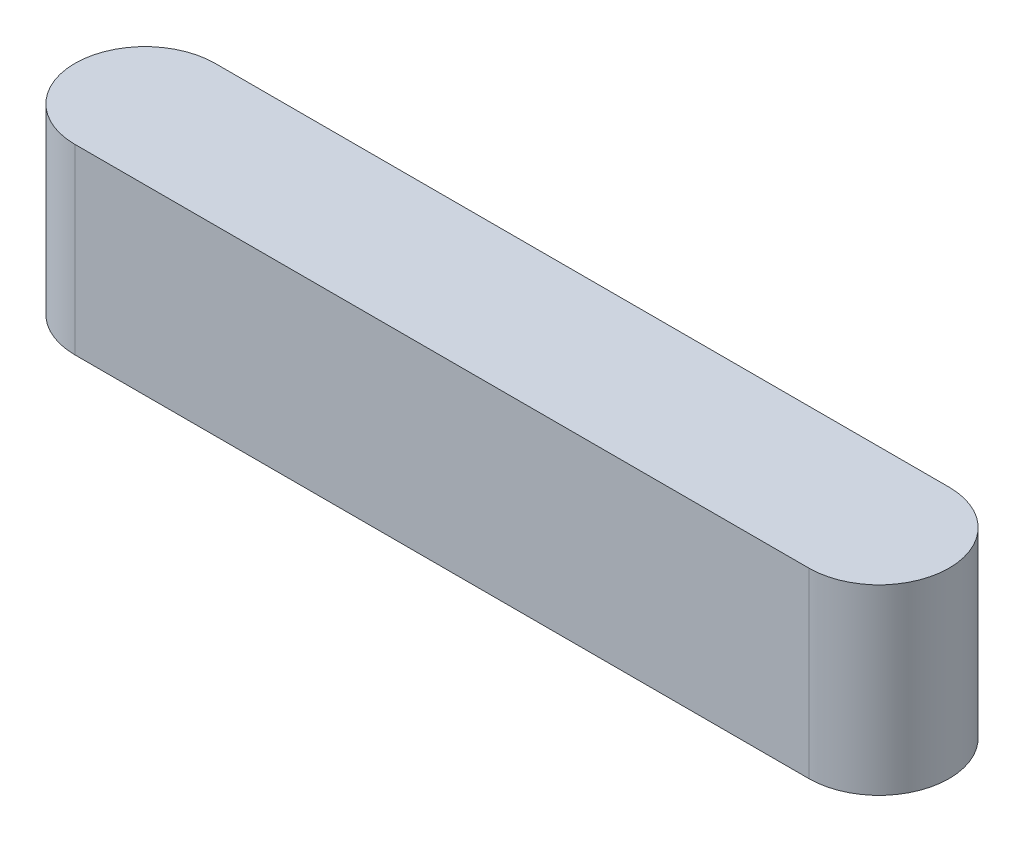
ISO-10303-21;
HEADER;
FILE_DESCRIPTION(('STEP AP214'),'2;1');
FILE_NAME('part.step','',(''),(''),'','','');
FILE_SCHEMA(('AUTOMOTIVE_DESIGN { 1 0 10303 214 1 1 1 1 }'));
ENDSEC;
DATA;
#1=APPLICATION_CONTEXT('core data for automotive mechanical design processes');
#2=APPLICATION_PROTOCOL_DEFINITION('international standard','automotive_design',2000,#1);
#3=PRODUCT_CONTEXT('',#1,'mechanical');
#4=PRODUCT('Part','Part','',(#3));
#5=PRODUCT_RELATED_PRODUCT_CATEGORY('part','',(#4));
#6=PRODUCT_DEFINITION_FORMATION('','',#4);
#7=PRODUCT_DEFINITION_CONTEXT('part definition',#1,'design');
#8=PRODUCT_DEFINITION('design','',#6,#7);
#9=PRODUCT_DEFINITION_SHAPE('','',#8);
#10=(LENGTH_UNIT() NAMED_UNIT(*) SI_UNIT(.MILLI.,.METRE.));
#11=(NAMED_UNIT(*) PLANE_ANGLE_UNIT() SI_UNIT($,.RADIAN.));
#12=(NAMED_UNIT(*) SI_UNIT($,.STERADIAN.) SOLID_ANGLE_UNIT());
#13=UNCERTAINTY_MEASURE_WITH_UNIT(LENGTH_MEASURE(1.E-05),#10,'distance_accuracy_value','');
#14=(GEOMETRIC_REPRESENTATION_CONTEXT(3) GLOBAL_UNCERTAINTY_ASSIGNED_CONTEXT((#13)) GLOBAL_UNIT_ASSIGNED_CONTEXT((#10,
#11,#12)) REPRESENTATION_CONTEXT('',''));
#15=CARTESIAN_POINT('',(0.,0.,0.));
#16=DIRECTION('',(0.,0.,1.));
#17=DIRECTION('',(1.,0.,0.));
#18=AXIS2_PLACEMENT_3D('',#15,#16,#17);
#19=CARTESIAN_POINT('',(0.,7.8,0.));
#20=DIRECTION('',(0.,-1.,0.));
#21=DIRECTION('',(0.,0.,-1.));
#22=AXIS2_PLACEMENT_3D('',#19,#20,#21);
#23=CYLINDRICAL_SURFACE('',#22,3.);
#24=CARTESIAN_POINT('',(0.,0.,0.));
#25=DIRECTION('',(0.,1.,0.));
#26=DIRECTION('',(0.,0.,1.));
#27=AXIS2_PLACEMENT_3D('',#24,#25,#26);
#28=CIRCLE('',#27,3.);
#29=CARTESIAN_POINT('',(0.,0.,-3.));
#30=VERTEX_POINT('',#29);
#31=CARTESIAN_POINT('',(0.,0.,3.));
#32=VERTEX_POINT('',#31);
#33=EDGE_CURVE('E107',#30,#32,#28,.T.);
#34=ORIENTED_EDGE('',*,*,#33,.T.);
#35=DIRECTION('',(0.,-1.,0.));
#36=VECTOR('',#35,1.);
#37=CARTESIAN_POINT('',(0.,7.8,3.));
#38=LINE('',#37,#36);
#39=CARTESIAN_POINT('',(0.,7.8,3.));
#40=VERTEX_POINT('',#39);
#41=EDGE_CURVE('E11',#40,#32,#38,.T.);
#42=ORIENTED_EDGE('',*,*,#41,.F.);
#43=CARTESIAN_POINT('',(0.,7.8,0.));
#44=DIRECTION('',(0.,1.,0.));
#45=DIRECTION('',(0.,0.,1.));
#46=AXIS2_PLACEMENT_3D('',#43,#44,#45);
#47=CIRCLE('',#46,3.);
#48=CARTESIAN_POINT('',(0.,7.8,-3.));
#49=VERTEX_POINT('',#48);
#50=EDGE_CURVE('E91',#49,#40,#47,.T.);
#51=ORIENTED_EDGE('',*,*,#50,.F.);
#52=DIRECTION('',(0.,-1.,0.));
#53=VECTOR('',#52,1.);
#54=CARTESIAN_POINT('',(0.,7.8,-3.));
#55=LINE('',#54,#53);
#56=EDGE_CURVE('E103',#49,#30,#55,.T.);
#57=ORIENTED_EDGE('',*,*,#56,.T.);
#58=EDGE_LOOP('',(#34,#42,#51,#57));
#59=FACE_BOUND('',#58,.T.);
#60=ADVANCED_FACE('F39',(#59),#23,.T.);
#61=CARTESIAN_POINT('',(0.,7.8,3.));
#62=DIRECTION('',(0.,0.,-1.));
#63=DIRECTION('',(-1.,0.,0.));
#64=AXIS2_PLACEMENT_3D('',#61,#62,#63);
#65=PLANE('',#64);
#66=DIRECTION('',(1.,0.,0.));
#67=VECTOR('',#66,1.);
#68=CARTESIAN_POINT('',(0.,0.,3.));
#69=LINE('',#68,#67);
#70=CARTESIAN_POINT('',(31.4,0.,3.));
#71=VERTEX_POINT('',#70);
#72=EDGE_CURVE('E96',#32,#71,#69,.T.);
#73=ORIENTED_EDGE('',*,*,#72,.T.);
#74=DIRECTION('',(0.,-1.,0.));
#75=VECTOR('',#74,1.);
#76=CARTESIAN_POINT('',(31.4,7.8,3.));
#77=LINE('',#76,#75);
#78=CARTESIAN_POINT('',(31.4,7.8,3.));
#79=VERTEX_POINT('',#78);
#80=EDGE_CURVE('E48',#79,#71,#77,.T.);
#81=ORIENTED_EDGE('',*,*,#80,.F.);
#82=DIRECTION('',(1.,0.,0.));
#83=VECTOR('',#82,1.);
#84=CARTESIAN_POINT('',(0.,7.8,3.));
#85=LINE('',#84,#83);
#86=EDGE_CURVE('E86',#40,#79,#85,.T.);
#87=ORIENTED_EDGE('',*,*,#86,.F.);
#88=ORIENTED_EDGE('',*,*,#41,.T.);
#89=EDGE_LOOP('',(#73,#81,#87,#88));
#90=FACE_BOUND('',#89,.T.);
#91=ADVANCED_FACE('F95',(#90),#65,.F.);
#92=CARTESIAN_POINT('',(31.4,7.8,0.));
#93=DIRECTION('',(0.,-1.,0.));
#94=DIRECTION('',(0.,0.,-1.));
#95=AXIS2_PLACEMENT_3D('',#92,#93,#94);
#96=CYLINDRICAL_SURFACE('',#95,3.);
#97=CARTESIAN_POINT('',(31.4,0.,0.));
#98=DIRECTION('',(0.,1.,0.));
#99=DIRECTION('',(0.,0.,1.));
#100=AXIS2_PLACEMENT_3D('',#97,#98,#99);
#101=CIRCLE('',#100,3.);
#102=CARTESIAN_POINT('',(31.4,0.,-3.));
#103=VERTEX_POINT('',#102);
#104=EDGE_CURVE('E73',#71,#103,#101,.T.);
#105=ORIENTED_EDGE('',*,*,#104,.T.);
#106=DIRECTION('',(0.,-1.,0.));
#107=VECTOR('',#106,1.);
#108=CARTESIAN_POINT('',(31.4,7.8,-3.));
#109=LINE('',#108,#107);
#110=CARTESIAN_POINT('',(31.4,7.8,-3.));
#111=VERTEX_POINT('',#110);
#112=EDGE_CURVE('E98',#111,#103,#109,.T.);
#113=ORIENTED_EDGE('',*,*,#112,.F.);
#114=CARTESIAN_POINT('',(31.4,7.8,0.));
#115=DIRECTION('',(0.,1.,0.));
#116=DIRECTION('',(0.,0.,1.));
#117=AXIS2_PLACEMENT_3D('',#114,#115,#116);
#118=CIRCLE('',#117,3.);
#119=EDGE_CURVE('E89',#79,#111,#118,.T.);
#120=ORIENTED_EDGE('',*,*,#119,.F.);
#121=ORIENTED_EDGE('',*,*,#80,.T.);
#122=EDGE_LOOP('',(#105,#113,#120,#121));
#123=FACE_BOUND('',#122,.T.);
#124=ADVANCED_FACE('F99',(#123),#96,.T.);
#125=CARTESIAN_POINT('',(0.,7.8,-3.));
#126=DIRECTION('',(0.,0.,1.));
#127=DIRECTION('',(1.,0.,0.));
#128=AXIS2_PLACEMENT_3D('',#125,#126,#127);
#129=PLANE('',#128);
#130=DIRECTION('',(-1.,0.,0.));
#131=VECTOR('',#130,1.);
#132=CARTESIAN_POINT('',(0.,0.,-3.));
#133=LINE('',#132,#131);
#134=EDGE_CURVE('E79',#103,#30,#133,.T.);
#135=ORIENTED_EDGE('',*,*,#134,.T.);
#136=ORIENTED_EDGE('',*,*,#56,.F.);
#137=DIRECTION('',(-1.,0.,0.));
#138=VECTOR('',#137,1.);
#139=CARTESIAN_POINT('',(0.,7.8,-3.));
#140=LINE('',#139,#138);
#141=EDGE_CURVE('E56',#111,#49,#140,.T.);
#142=ORIENTED_EDGE('',*,*,#141,.F.);
#143=ORIENTED_EDGE('',*,*,#112,.T.);
#144=EDGE_LOOP('',(#135,#136,#142,#143));
#145=FACE_BOUND('',#144,.T.);
#146=ADVANCED_FACE('F120',(#145),#129,.F.);
#147=CARTESIAN_POINT('',(0.,7.8,0.));
#148=DIRECTION('',(0.,1.,0.));
#149=DIRECTION('',(0.,0.,1.));
#150=AXIS2_PLACEMENT_3D('',#147,#148,#149);
#151=PLANE('',#150);
#152=ORIENTED_EDGE('',*,*,#50,.T.);
#153=ORIENTED_EDGE('',*,*,#86,.T.);
#154=ORIENTED_EDGE('',*,*,#119,.T.);
#155=ORIENTED_EDGE('',*,*,#141,.T.);
#156=EDGE_LOOP('',(#152,#153,#154,#155));
#157=FACE_BOUND('',#156,.T.);
#158=ADVANCED_FACE('F87',(#157),#151,.T.);
#159=CARTESIAN_POINT('',(0.,0.,0.));
#160=DIRECTION('',(0.,1.,0.));
#161=DIRECTION('',(0.,0.,1.));
#162=AXIS2_PLACEMENT_3D('',#159,#160,#161);
#163=PLANE('',#162);
#164=ORIENTED_EDGE('',*,*,#33,.F.);
#165=ORIENTED_EDGE('',*,*,#134,.F.);
#166=ORIENTED_EDGE('',*,*,#104,.F.);
#167=ORIENTED_EDGE('',*,*,#72,.F.);
#168=EDGE_LOOP('',(#164,#165,#166,#167));
#169=FACE_BOUND('',#168,.T.);
#170=ADVANCED_FACE('F123',(#169),#163,.F.);
#171=CLOSED_SHELL('',(#60,#91,#124,#146,#158,#170));
#172=MANIFOLD_SOLID_BREP('B2',#171);
#173=ADVANCED_BREP_SHAPE_REPRESENTATION('',(#18,#172),#14);
#174=SHAPE_DEFINITION_REPRESENTATION(#9,#173);
ENDSEC;
END-ISO-10303-21;
